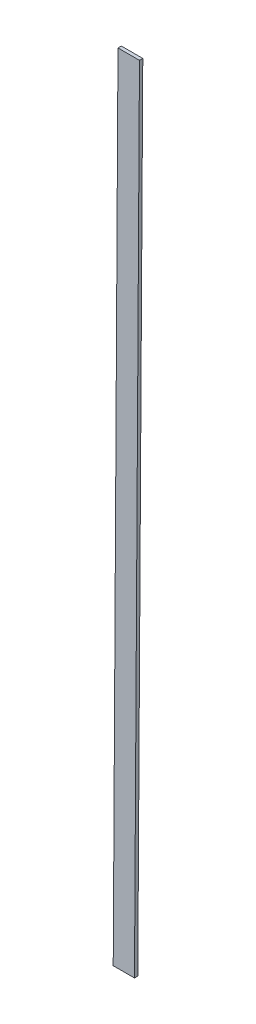
ISO-10303-21;
HEADER;
FILE_DESCRIPTION(('STEP AP214'),'2;1');
FILE_NAME('part.step','',(''),(''),'','','');
FILE_SCHEMA(('AUTOMOTIVE_DESIGN { 1 0 10303 214 1 1 1 1 }'));
ENDSEC;
DATA;
#1=APPLICATION_CONTEXT('core data for automotive mechanical design processes');
#2=APPLICATION_PROTOCOL_DEFINITION('international standard','automotive_design',2000,#1);
#3=PRODUCT_CONTEXT('',#1,'mechanical');
#4=PRODUCT('Part','Part','',(#3));
#5=PRODUCT_RELATED_PRODUCT_CATEGORY('part','',(#4));
#6=PRODUCT_DEFINITION_FORMATION('','',#4);
#7=PRODUCT_DEFINITION_CONTEXT('part definition',#1,'design');
#8=PRODUCT_DEFINITION('design','',#6,#7);
#9=PRODUCT_DEFINITION_SHAPE('','',#8);
#10=(LENGTH_UNIT() NAMED_UNIT(*) SI_UNIT(.MILLI.,.METRE.));
#11=(NAMED_UNIT(*) PLANE_ANGLE_UNIT() SI_UNIT($,.RADIAN.));
#12=(NAMED_UNIT(*) SI_UNIT($,.STERADIAN.) SOLID_ANGLE_UNIT());
#13=UNCERTAINTY_MEASURE_WITH_UNIT(LENGTH_MEASURE(1.E-05),#10,'distance_accuracy_value','');
#14=(GEOMETRIC_REPRESENTATION_CONTEXT(3) GLOBAL_UNCERTAINTY_ASSIGNED_CONTEXT((#13)) GLOBAL_UNIT_ASSIGNED_CONTEXT((#10,
#11,#12)) REPRESENTATION_CONTEXT('',''));
#15=CARTESIAN_POINT('',(0.,0.,0.));
#16=DIRECTION('',(0.,0.,1.));
#17=DIRECTION('',(1.,0.,0.));
#18=AXIS2_PLACEMENT_3D('',#15,#16,#17);
#19=CARTESIAN_POINT('',(-47.7982863284494,292.553338008966,1.5875));
#20=DIRECTION('',(0.,-1.,0.));
#21=DIRECTION('',(0.,0.,-1.));
#22=AXIS2_PLACEMENT_3D('',#19,#20,#21);
#23=PLANE('',#22);
#24=DIRECTION('',(-1.,0.,0.));
#25=VECTOR('',#24,1.);
#26=CARTESIAN_POINT('',(-47.7982863284494,292.553338008966,0.));
#27=LINE('',#26,#25);
#28=CARTESIAN_POINT('',(-47.7982863284494,292.553338008966,0.));
#29=VERTEX_POINT('',#28);
#30=CARTESIAN_POINT('',(-58.0702043179671,292.553338008966,0.));
#31=VERTEX_POINT('',#30);
#32=EDGE_CURVE('E95',#29,#31,#27,.T.);
#33=ORIENTED_EDGE('',*,*,#32,.T.);
#34=DIRECTION('',(0.,0.,-1.));
#35=VECTOR('',#34,1.);
#36=CARTESIAN_POINT('',(-58.0702043179671,292.553338008966,1.5875));
#37=LINE('',#36,#35);
#38=CARTESIAN_POINT('',(-58.0702043179671,292.553338008966,1.5875));
#39=VERTEX_POINT('',#38);
#40=EDGE_CURVE('E11',#39,#31,#37,.T.);
#41=ORIENTED_EDGE('',*,*,#40,.F.);
#42=DIRECTION('',(-1.,0.,0.));
#43=VECTOR('',#42,1.);
#44=CARTESIAN_POINT('',(-47.7982863284494,292.553338008966,1.5875));
#45=LINE('',#44,#43);
#46=CARTESIAN_POINT('',(-47.7982863284494,292.553338008966,1.5875));
#47=VERTEX_POINT('',#46);
#48=EDGE_CURVE('E83',#47,#39,#45,.T.);
#49=ORIENTED_EDGE('',*,*,#48,.F.);
#50=DIRECTION('',(0.,0.,-1.));
#51=VECTOR('',#50,1.);
#52=CARTESIAN_POINT('',(-47.7982863284494,292.553338008966,1.5875));
#53=LINE('',#52,#51);
#54=EDGE_CURVE('E91',#47,#29,#53,.T.);
#55=ORIENTED_EDGE('',*,*,#54,.T.);
#56=EDGE_LOOP('',(#33,#41,#49,#55));
#57=FACE_BOUND('',#56,.T.);
#58=ADVANCED_FACE('F32',(#57),#23,.F.);
#59=CARTESIAN_POINT('',(-58.0702043179671,292.553338008966,1.5875));
#60=DIRECTION('',(0.999982112142968,-0.00598125355502489,0.));
#61=DIRECTION('',(0.00598125355502489,0.999982112142968,0.));
#62=AXIS2_PLACEMENT_3D('',#59,#60,#61);
#63=PLANE('',#62);
#64=DIRECTION('',(-0.00598125355502489,-0.999982112142968,0.));
#65=VECTOR('',#64,1.);
#66=CARTESIAN_POINT('',(-58.0702043179671,292.553338008966,0.));
#67=LINE('',#66,#65);
#68=CARTESIAN_POINT('',(-60.3491654179901,-88.4571497303671,0.));
#69=VERTEX_POINT('',#68);
#70=EDGE_CURVE('E87',#31,#69,#67,.T.);
#71=ORIENTED_EDGE('',*,*,#70,.T.);
#72=DIRECTION('',(0.,0.,-1.));
#73=VECTOR('',#72,1.);
#74=CARTESIAN_POINT('',(-60.3491654179901,-88.4571497303671,1.5875));
#75=LINE('',#74,#73);
#76=CARTESIAN_POINT('',(-60.3491654179901,-88.4571497303671,1.5875));
#77=VERTEX_POINT('',#76);
#78=EDGE_CURVE('E40',#77,#69,#75,.T.);
#79=ORIENTED_EDGE('',*,*,#78,.F.);
#80=DIRECTION('',(-0.00598125355502489,-0.999982112142968,0.));
#81=VECTOR('',#80,1.);
#82=CARTESIAN_POINT('',(-58.0702043179671,292.553338008966,1.5875));
#83=LINE('',#82,#81);
#84=EDGE_CURVE('E78',#39,#77,#83,.T.);
#85=ORIENTED_EDGE('',*,*,#84,.F.);
#86=ORIENTED_EDGE('',*,*,#40,.T.);
#87=EDGE_LOOP('',(#71,#79,#85,#86));
#88=FACE_BOUND('',#87,.T.);
#89=ADVANCED_FACE('F86',(#88),#63,.F.);
#90=CARTESIAN_POINT('',(-60.3491654179901,-88.4571497303671,1.5875));
#91=DIRECTION('',(0.,1.,0.));
#92=DIRECTION('',(0.,0.,1.));
#93=AXIS2_PLACEMENT_3D('',#90,#91,#92);
#94=PLANE('',#93);
#95=DIRECTION('',(1.,0.,0.));
#96=VECTOR('',#95,1.);
#97=CARTESIAN_POINT('',(-60.3491654179901,-88.4571497303671,0.));
#98=LINE('',#97,#96);
#99=CARTESIAN_POINT('',(-50.1891654179901,-88.4571497303671,0.));
#100=VERTEX_POINT('',#99);
#101=EDGE_CURVE('E65',#69,#100,#98,.T.);
#102=ORIENTED_EDGE('',*,*,#101,.T.);
#103=DIRECTION('',(0.,0.,-1.));
#104=VECTOR('',#103,1.);
#105=CARTESIAN_POINT('',(-50.1891654179901,-88.4571497303671,1.5875));
#106=LINE('',#105,#104);
#107=CARTESIAN_POINT('',(-50.1891654179901,-88.4571497303671,1.5875));
#108=VERTEX_POINT('',#107);
#109=EDGE_CURVE('E88',#108,#100,#106,.T.);
#110=ORIENTED_EDGE('',*,*,#109,.F.);
#111=DIRECTION('',(1.,0.,0.));
#112=VECTOR('',#111,1.);
#113=CARTESIAN_POINT('',(-60.3491654179901,-88.4571497303671,1.5875));
#114=LINE('',#113,#112);
#115=EDGE_CURVE('E81',#77,#108,#114,.T.);
#116=ORIENTED_EDGE('',*,*,#115,.F.);
#117=ORIENTED_EDGE('',*,*,#78,.T.);
#118=EDGE_LOOP('',(#102,#110,#116,#117));
#119=FACE_BOUND('',#118,.T.);
#120=ADVANCED_FACE('F89',(#119),#94,.F.);
#121=CARTESIAN_POINT('',(-50.1891654179901,-88.4571497303671,1.5875));
#122=DIRECTION('',(-0.999980312138498,0.00627497692367984,0.));
#123=DIRECTION('',(-0.00627497692367984,-0.999980312138498,0.));
#124=AXIS2_PLACEMENT_3D('',#121,#122,#123);
#125=PLANE('',#124);
#126=DIRECTION('',(0.00627497692367984,0.999980312138498,0.));
#127=VECTOR('',#126,1.);
#128=CARTESIAN_POINT('',(-50.1891654179901,-88.4571497303671,0.));
#129=LINE('',#128,#127);
#130=EDGE_CURVE('E71',#100,#29,#129,.T.);
#131=ORIENTED_EDGE('',*,*,#130,.T.);
#132=ORIENTED_EDGE('',*,*,#54,.F.);
#133=DIRECTION('',(0.00627497692367984,0.999980312138498,0.));
#134=VECTOR('',#133,1.);
#135=CARTESIAN_POINT('',(-50.1891654179901,-88.4571497303671,1.5875));
#136=LINE('',#135,#134);
#137=EDGE_CURVE('E48',#108,#47,#136,.T.);
#138=ORIENTED_EDGE('',*,*,#137,.F.);
#139=ORIENTED_EDGE('',*,*,#109,.T.);
#140=EDGE_LOOP('',(#131,#132,#138,#139));
#141=FACE_BOUND('',#140,.T.);
#142=ADVANCED_FACE('F102',(#141),#125,.F.);
#143=CARTESIAN_POINT('',(0.,0.,1.5875));
#144=DIRECTION('',(0.,0.,1.));
#145=DIRECTION('',(1.,0.,0.));
#146=AXIS2_PLACEMENT_3D('',#143,#144,#145);
#147=PLANE('',#146);
#148=ORIENTED_EDGE('',*,*,#48,.T.);
#149=ORIENTED_EDGE('',*,*,#84,.T.);
#150=ORIENTED_EDGE('',*,*,#115,.T.);
#151=ORIENTED_EDGE('',*,*,#137,.T.);
#152=EDGE_LOOP('',(#148,#149,#150,#151));
#153=FACE_BOUND('',#152,.T.);
#154=ADVANCED_FACE('F79',(#153),#147,.T.);
#155=CARTESIAN_POINT('',(0.,0.,0.));
#156=DIRECTION('',(0.,0.,1.));
#157=DIRECTION('',(1.,0.,0.));
#158=AXIS2_PLACEMENT_3D('',#155,#156,#157);
#159=PLANE('',#158);
#160=ORIENTED_EDGE('',*,*,#32,.F.);
#161=ORIENTED_EDGE('',*,*,#130,.F.);
#162=ORIENTED_EDGE('',*,*,#101,.F.);
#163=ORIENTED_EDGE('',*,*,#70,.F.);
#164=EDGE_LOOP('',(#160,#161,#162,#163));
#165=FACE_BOUND('',#164,.T.);
#166=ADVANCED_FACE('F105',(#165),#159,.F.);
#167=CLOSED_SHELL('',(#58,#89,#120,#142,#154,#166));
#168=MANIFOLD_SOLID_BREP('B2',#167);
#169=ADVANCED_BREP_SHAPE_REPRESENTATION('',(#18,#168),#14);
#170=SHAPE_DEFINITION_REPRESENTATION(#9,#169);
ENDSEC;
END-ISO-10303-21;
